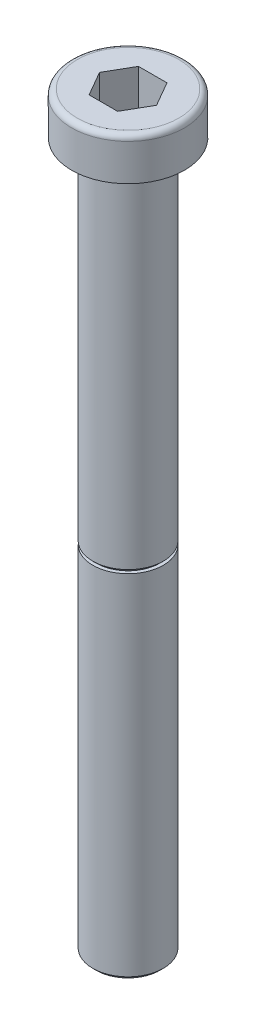
ISO-10303-21;
HEADER;
FILE_DESCRIPTION(('STEP AP214'),'2;1');
FILE_NAME('part.step','',(''),(''),'','','');
FILE_SCHEMA(('AUTOMOTIVE_DESIGN { 1 0 10303 214 1 1 1 1 }'));
ENDSEC;
DATA;
#1=APPLICATION_CONTEXT('core data for automotive mechanical design processes');
#2=APPLICATION_PROTOCOL_DEFINITION('international standard','automotive_design',2000,#1);
#3=PRODUCT_CONTEXT('',#1,'mechanical');
#4=PRODUCT('Part','Part','',(#3));
#5=PRODUCT_RELATED_PRODUCT_CATEGORY('part','',(#4));
#6=PRODUCT_DEFINITION_FORMATION('','',#4);
#7=PRODUCT_DEFINITION_CONTEXT('part definition',#1,'design');
#8=PRODUCT_DEFINITION('design','',#6,#7);
#9=PRODUCT_DEFINITION_SHAPE('','',#8);
#10=(LENGTH_UNIT() NAMED_UNIT(*) SI_UNIT(.MILLI.,.METRE.));
#11=(NAMED_UNIT(*) PLANE_ANGLE_UNIT() SI_UNIT($,.RADIAN.));
#12=(NAMED_UNIT(*) SI_UNIT($,.STERADIAN.) SOLID_ANGLE_UNIT());
#13=UNCERTAINTY_MEASURE_WITH_UNIT(LENGTH_MEASURE(1.E-05),#10,'distance_accuracy_value','');
#14=(GEOMETRIC_REPRESENTATION_CONTEXT(3) GLOBAL_UNCERTAINTY_ASSIGNED_CONTEXT((#13)) GLOBAL_UNIT_ASSIGNED_CONTEXT((#10,
#11,#12)) REPRESENTATION_CONTEXT('',''));
#15=CARTESIAN_POINT('',(0.,0.,0.));
#16=DIRECTION('',(0.,0.,1.));
#17=DIRECTION('',(1.,0.,0.));
#18=AXIS2_PLACEMENT_3D('',#15,#16,#17);
#19=CARTESIAN_POINT('',(-631.679347611486,-137.30907216884,-866.236135779287));
#20=DIRECTION('',(0.,1.,0.));
#21=DIRECTION('',(-1.,0.,0.));
#22=AXIS2_PLACEMENT_3D('',#19,#20,#21);
#23=PLANE('',#22);
#24=DIRECTION('',(-0.5,0.,-0.866025403784439));
#25=VECTOR('',#24,1.);
#26=CARTESIAN_POINT('',(-634.710436524731,-137.30907216884,-864.486135779287));
#27=LINE('',#26,#25);
#28=CARTESIAN_POINT('',(-633.70007355365,-137.30907216884,-862.736135779289));
#29=VERTEX_POINT('',#28);
#30=CARTESIAN_POINT('',(-635.720799495813,-137.30907216884,-866.236135779288));
#31=VERTEX_POINT('',#30);
#32=EDGE_CURVE('E355',#29,#31,#27,.T.);
#33=ORIENTED_EDGE('',*,*,#32,.F.);
#34=DIRECTION('',(-1.,0.,0.));
#35=VECTOR('',#34,1.);
#36=CARTESIAN_POINT('',(-631.679347611486,-137.30907216884,-862.736135779289));
#37=LINE('',#36,#35);
#38=CARTESIAN_POINT('',(-629.658621669321,-137.30907216884,-862.736135779289));
#39=VERTEX_POINT('',#38);
#40=EDGE_CURVE('E356',#39,#29,#37,.T.);
#41=ORIENTED_EDGE('',*,*,#40,.F.);
#42=DIRECTION('',(-0.5,0.,0.866025403784439));
#43=VECTOR('',#42,1.);
#44=CARTESIAN_POINT('',(-628.64825869824,-137.30907216884,-864.486135779287));
#45=LINE('',#44,#43);
#46=CARTESIAN_POINT('',(-627.637895727158,-137.30907216884,-866.236135779287));
#47=VERTEX_POINT('',#46);
#48=EDGE_CURVE('E67',#47,#39,#45,.T.);
#49=ORIENTED_EDGE('',*,*,#48,.F.);
#50=DIRECTION('',(0.5,0.,0.866025403784439));
#51=VECTOR('',#50,1.);
#52=CARTESIAN_POINT('',(-628.64825869824,-137.30907216884,-867.986135779288));
#53=LINE('',#52,#51);
#54=CARTESIAN_POINT('',(-629.658621669322,-137.30907216884,-869.736135779289));
#55=VERTEX_POINT('',#54);
#56=EDGE_CURVE('E64',#55,#47,#53,.T.);
#57=ORIENTED_EDGE('',*,*,#56,.F.);
#58=DIRECTION('',(1.,0.,0.));
#59=VECTOR('',#58,1.);
#60=CARTESIAN_POINT('',(-631.679347611486,-137.30907216884,-869.736135779289));
#61=LINE('',#60,#59);
#62=CARTESIAN_POINT('',(-633.700073553649,-137.30907216884,-869.736135779289));
#63=VERTEX_POINT('',#62);
#64=EDGE_CURVE('E61',#63,#55,#61,.T.);
#65=ORIENTED_EDGE('',*,*,#64,.F.);
#66=DIRECTION('',(0.5,0.,-0.866025403784438));
#67=VECTOR('',#66,1.);
#68=CARTESIAN_POINT('',(-634.710436524731,-137.30907216884,-867.986135779288));
#69=LINE('',#68,#67);
#70=EDGE_CURVE('E81',#31,#63,#69,.T.);
#71=ORIENTED_EDGE('',*,*,#70,.F.);
#72=EDGE_LOOP('',(#33,#41,#49,#57,#65,#71));
#73=FACE_BOUND('',#72,.T.);
#74=ADVANCED_FACE('F17',(#73),#23,.T.);
#75=CARTESIAN_POINT('',(-628.64825869824,-131.30907216884,-867.986135779288));
#76=DIRECTION('',(-0.866025403784439,0.,0.5));
#77=DIRECTION('',(0.5,0.,0.866025403784439));
#78=AXIS2_PLACEMENT_3D('',#75,#76,#77);
#79=PLANE('',#78);
#80=DIRECTION('',(-0.499999999999829,0.,-0.866025403784537));
#81=VECTOR('',#80,1.);
#82=CARTESIAN_POINT('',(-627.637895727158,-131.30907216884,-866.236135779287));
#83=LINE('',#82,#81);
#84=CARTESIAN_POINT('',(-627.637895727158,-131.30907216884,-866.236135779287));
#85=VERTEX_POINT('',#84);
#86=CARTESIAN_POINT('',(-629.658621669322,-131.30907216884,-869.736135779289));
#87=VERTEX_POINT('',#86);
#88=EDGE_CURVE('E77',#85,#87,#83,.T.);
#89=ORIENTED_EDGE('',*,*,#88,.T.);
#90=DIRECTION('',(0.,1.,0.));
#91=VECTOR('',#90,1.);
#92=CARTESIAN_POINT('',(-629.658621669322,-131.30907216884,-869.736135779289));
#93=LINE('',#92,#91);
#94=EDGE_CURVE('E74',#55,#87,#93,.T.);
#95=ORIENTED_EDGE('',*,*,#94,.F.);
#96=ORIENTED_EDGE('',*,*,#56,.T.);
#97=DIRECTION('',(0.,1.,0.));
#98=VECTOR('',#97,1.);
#99=CARTESIAN_POINT('',(-627.637895727158,-131.30907216884,-866.236135779287));
#100=LINE('',#99,#98);
#101=EDGE_CURVE('E131',#85,#47,#100,.F.);
#102=ORIENTED_EDGE('',*,*,#101,.F.);
#103=EDGE_LOOP('',(#89,#95,#96,#102));
#104=FACE_BOUND('',#103,.T.);
#105=ADVANCED_FACE('F75',(#104),#79,.T.);
#106=CARTESIAN_POINT('',(-631.679347611486,-131.30907216884,-869.736135779289));
#107=DIRECTION('',(0.,0.,1.));
#108=DIRECTION('',(1.,0.,0.));
#109=AXIS2_PLACEMENT_3D('',#106,#107,#108);
#110=PLANE('',#109);
#111=DIRECTION('',(1.,0.,0.));
#112=VECTOR('',#111,1.);
#113=CARTESIAN_POINT('',(-635.679347611485,-131.30907216884,-869.736135779289));
#114=LINE('',#113,#112);
#115=CARTESIAN_POINT('',(-633.700073553649,-131.30907216884,-869.736135779289));
#116=VERTEX_POINT('',#115);
#117=EDGE_CURVE('E128',#87,#116,#114,.F.);
#118=ORIENTED_EDGE('',*,*,#117,.T.);
#119=DIRECTION('',(0.,1.,0.));
#120=VECTOR('',#119,1.);
#121=CARTESIAN_POINT('',(-633.700073553649,-131.30907216884,-869.736135779289));
#122=LINE('',#121,#120);
#123=EDGE_CURVE('E85',#63,#116,#122,.T.);
#124=ORIENTED_EDGE('',*,*,#123,.F.);
#125=ORIENTED_EDGE('',*,*,#64,.T.);
#126=ORIENTED_EDGE('',*,*,#94,.T.);
#127=EDGE_LOOP('',(#118,#124,#125,#126));
#128=FACE_BOUND('',#127,.T.);
#129=ADVANCED_FACE('F83',(#128),#110,.T.);
#130=CARTESIAN_POINT('',(-634.710436524731,-131.30907216884,-867.986135779288));
#131=DIRECTION('',(0.866025403784438,0.,0.5));
#132=DIRECTION('',(0.5,0.,-0.866025403784438));
#133=AXIS2_PLACEMENT_3D('',#130,#131,#132);
#134=PLANE('',#133);
#135=DIRECTION('',(-0.500000000000261,0.,0.866025403784288));
#136=VECTOR('',#135,1.);
#137=CARTESIAN_POINT('',(-633.700073553649,-131.30907216884,-869.736135779288));
#138=LINE('',#137,#136);
#139=CARTESIAN_POINT('',(-635.720799495814,-131.30907216884,-866.236135779288));
#140=VERTEX_POINT('',#139);
#141=EDGE_CURVE('E125',#116,#140,#138,.T.);
#142=ORIENTED_EDGE('',*,*,#141,.T.);
#143=DIRECTION('',(0.,1.,0.));
#144=VECTOR('',#143,1.);
#145=CARTESIAN_POINT('',(-635.720799495814,-131.30907216884,-866.236135779289));
#146=LINE('',#145,#144);
#147=EDGE_CURVE('E347',#31,#140,#146,.T.);
#148=ORIENTED_EDGE('',*,*,#147,.F.);
#149=ORIENTED_EDGE('',*,*,#70,.T.);
#150=ORIENTED_EDGE('',*,*,#123,.T.);
#151=EDGE_LOOP('',(#142,#148,#149,#150));
#152=FACE_BOUND('',#151,.T.);
#153=ADVANCED_FACE('F188',(#152),#134,.T.);
#154=CARTESIAN_POINT('',(-634.710436524731,-131.30907216884,-864.486135779287));
#155=DIRECTION('',(0.866025403784439,0.,-0.5));
#156=DIRECTION('',(-0.5,0.,-0.866025403784439));
#157=AXIS2_PLACEMENT_3D('',#154,#155,#156);
#158=PLANE('',#157);
#159=DIRECTION('',(0.499999999999998,0.,0.86602540378444));
#160=VECTOR('',#159,1.);
#161=CARTESIAN_POINT('',(-635.720799495814,-131.30907216884,-866.236135779288));
#162=LINE('',#161,#160);
#163=CARTESIAN_POINT('',(-633.70007355365,-131.30907216884,-862.736135779289));
#164=VERTEX_POINT('',#163);
#165=EDGE_CURVE('E115',#140,#164,#162,.T.);
#166=ORIENTED_EDGE('',*,*,#165,.T.);
#167=DIRECTION('',(0.,1.,0.));
#168=VECTOR('',#167,1.);
#169=CARTESIAN_POINT('',(-633.70007355365,-131.30907216884,-862.736135779289));
#170=LINE('',#169,#168);
#171=EDGE_CURVE('E363',#29,#164,#170,.T.);
#172=ORIENTED_EDGE('',*,*,#171,.F.);
#173=ORIENTED_EDGE('',*,*,#32,.T.);
#174=ORIENTED_EDGE('',*,*,#147,.T.);
#175=EDGE_LOOP('',(#166,#172,#173,#174));
#176=FACE_BOUND('',#175,.T.);
#177=ADVANCED_FACE('F184',(#176),#158,.T.);
#178=CARTESIAN_POINT('',(-631.679347611486,-131.30907216884,-862.736135779289));
#179=DIRECTION('',(0.,0.,-1.));
#180=DIRECTION('',(-1.,0.,0.));
#181=AXIS2_PLACEMENT_3D('',#178,#179,#180);
#182=PLANE('',#181);
#183=DIRECTION('',(1.,0.,0.));
#184=VECTOR('',#183,1.);
#185=CARTESIAN_POINT('',(-635.679347611485,-131.30907216884,-862.736135779289));
#186=LINE('',#185,#184);
#187=CARTESIAN_POINT('',(-629.658621669321,-131.30907216884,-862.736135779289));
#188=VERTEX_POINT('',#187);
#189=EDGE_CURVE('E109',#164,#188,#186,.T.);
#190=ORIENTED_EDGE('',*,*,#189,.T.);
#191=DIRECTION('',(0.,1.,0.));
#192=VECTOR('',#191,1.);
#193=CARTESIAN_POINT('',(-629.658621669321,-131.30907216884,-862.736135779289));
#194=LINE('',#193,#192);
#195=EDGE_CURVE('E362',#39,#188,#194,.T.);
#196=ORIENTED_EDGE('',*,*,#195,.F.);
#197=ORIENTED_EDGE('',*,*,#40,.T.);
#198=ORIENTED_EDGE('',*,*,#171,.T.);
#199=EDGE_LOOP('',(#190,#196,#197,#198));
#200=FACE_BOUND('',#199,.T.);
#201=ADVANCED_FACE('F181',(#200),#182,.T.);
#202=CARTESIAN_POINT('',(-628.64825869824,-131.30907216884,-864.486135779287));
#203=DIRECTION('',(-0.866025403784439,0.,-0.5));
#204=DIRECTION('',(-0.5,0.,0.866025403784439));
#205=AXIS2_PLACEMENT_3D('',#202,#203,#204);
#206=PLANE('',#205);
#207=DIRECTION('',(0.500000000000084,0.,-0.86602540378439));
#208=VECTOR('',#207,1.);
#209=CARTESIAN_POINT('',(-629.658621669321,-131.30907216884,-862.736135779289));
#210=LINE('',#209,#208);
#211=EDGE_CURVE('E104',#188,#85,#210,.T.);
#212=ORIENTED_EDGE('',*,*,#211,.T.);
#213=ORIENTED_EDGE('',*,*,#101,.T.);
#214=ORIENTED_EDGE('',*,*,#48,.T.);
#215=ORIENTED_EDGE('',*,*,#195,.T.);
#216=EDGE_LOOP('',(#212,#213,#214,#215));
#217=FACE_BOUND('',#216,.T.);
#218=ADVANCED_FACE('F177',(#217),#206,.T.);
#219=CARTESIAN_POINT('',(-633.929347611487,-237.30907216884,-866.236135779287));
#220=DIRECTION('',(0.,1.,0.));
#221=DIRECTION('',(-1.,0.,0.));
#222=AXIS2_PLACEMENT_3D('',#219,#220,#221);
#223=PLANE('',#222);
#224=CARTESIAN_POINT('',(-631.679347611486,-237.30907216884,-866.236135779287));
#225=DIRECTION('',(0.,1.,0.));
#226=DIRECTION('',(0.,0.,1.));
#227=AXIS2_PLACEMENT_3D('',#224,#225,#226);
#228=CIRCLE('',#227,4.50000000000006);
#229=CARTESIAN_POINT('',(-631.679347611486,-237.30907216884,-861.736135779287));
#230=VERTEX_POINT('',#229);
#231=EDGE_CURVE('E102',#230,#230,#228,.T.);
#232=ORIENTED_EDGE('',*,*,#231,.F.);
#233=EDGE_LOOP('',(#232));
#234=FACE_BOUND('',#233,.T.);
#235=ADVANCED_FACE('F172',(#234),#223,.F.);
#236=CARTESIAN_POINT('',(-635.679347611485,-131.30907216884,-866.236135779287));
#237=DIRECTION('',(0.,-1.,0.));
#238=DIRECTION('',(1.,0.,0.));
#239=AXIS2_PLACEMENT_3D('',#236,#237,#238);
#240=PLANE('',#239);
#241=ORIENTED_EDGE('',*,*,#189,.F.);
#242=ORIENTED_EDGE('',*,*,#165,.F.);
#243=ORIENTED_EDGE('',*,*,#141,.F.);
#244=ORIENTED_EDGE('',*,*,#117,.F.);
#245=ORIENTED_EDGE('',*,*,#88,.F.);
#246=ORIENTED_EDGE('',*,*,#211,.F.);
#247=EDGE_LOOP('',(#241,#242,#243,#244,#245,#246));
#248=FACE_BOUND('',#247,.T.);
#249=CARTESIAN_POINT('',(-631.679347611486,-131.309072168841,-866.236135779287));
#250=DIRECTION('',(0.,-1.,0.));
#251=DIRECTION('',(0.,0.,1.));
#252=AXIS2_PLACEMENT_3D('',#249,#250,#251);
#253=CIRCLE('',#252,7.20000000000021);
#254=CARTESIAN_POINT('',(-631.679347611486,-131.309072168841,-859.036135779287));
#255=VERTEX_POINT('',#254);
#256=CARTESIAN_POINT('',(-631.679347611486,-131.309072168841,-873.436135779288));
#257=VERTEX_POINT('',#256);
#258=EDGE_CURVE('E107',#255,#257,#253,.T.);
#259=ORIENTED_EDGE('',*,*,#258,.F.);
#260=CARTESIAN_POINT('',(-631.679347611486,-131.309072168841,-866.236135779287));
#261=DIRECTION('',(0.,-1.,0.));
#262=DIRECTION('',(0.,0.,-1.));
#263=AXIS2_PLACEMENT_3D('',#260,#261,#262);
#264=CIRCLE('',#263,7.20000000000087);
#265=EDGE_CURVE('E36',#257,#255,#264,.T.);
#266=ORIENTED_EDGE('',*,*,#265,.F.);
#267=EDGE_LOOP('',(#259,#266));
#268=FACE_BOUND('',#267,.T.);
#269=ADVANCED_FACE('F163',(#248,#268),#240,.F.);
#270=CARTESIAN_POINT('',(-631.679347611486,-236.80907216884,-866.236135779287));
#271=DIRECTION('',(0.,1.,0.));
#272=DIRECTION('',(0.,0.,1.));
#273=AXIS2_PLACEMENT_3D('',#270,#271,#272);
#274=CONICAL_SURFACE('',#273,5.,0.785398163397476);
#275=ORIENTED_EDGE('',*,*,#231,.T.);
#276=EDGE_LOOP('',(#275));
#277=FACE_BOUND('',#276,.T.);
#278=CARTESIAN_POINT('',(-631.679347611486,-236.80907216884,-866.236135779287));
#279=DIRECTION('',(0.,-1.,0.));
#280=DIRECTION('',(1.,0.,0.));
#281=AXIS2_PLACEMENT_3D('',#278,#279,#280);
#282=CIRCLE('',#281,4.99999999999999);
#283=CARTESIAN_POINT('',(-626.679347611486,-236.80907216884,-866.236135779287));
#284=VERTEX_POINT('',#283);
#285=EDGE_CURVE('E156',#284,#284,#282,.F.);
#286=ORIENTED_EDGE('',*,*,#285,.F.);
#287=EDGE_LOOP('',(#286));
#288=FACE_BOUND('',#287,.T.);
#289=ADVANCED_FACE('F149',(#277,#288),#274,.T.);
#290=CARTESIAN_POINT('',(-631.679347611486,-132.109072168841,-866.236135779287));
#291=DIRECTION('',(0.,1.,0.));
#292=DIRECTION('',(0.,0.,-1.));
#293=AXIS2_PLACEMENT_3D('',#290,#291,#292);
#294=TOROIDAL_SURFACE('',#293,7.2000000000001,0.8);
#295=CARTESIAN_POINT('',(-631.679347611486,-132.109072168841,-866.236135779287));
#296=DIRECTION('',(0.,-1.,0.));
#297=DIRECTION('',(1.,0.,0.));
#298=AXIS2_PLACEMENT_3D('',#295,#296,#297);
#299=CIRCLE('',#298,8.);
#300=CARTESIAN_POINT('',(-623.679347611486,-132.109072168841,-866.236135779287));
#301=VERTEX_POINT('',#300);
#302=EDGE_CURVE('E101',#301,#301,#299,.T.);
#303=ORIENTED_EDGE('',*,*,#302,.F.);
#304=EDGE_LOOP('',(#303));
#305=FACE_BOUND('',#304,.T.);
#306=ORIENTED_EDGE('',*,*,#258,.T.);
#307=ORIENTED_EDGE('',*,*,#265,.T.);
#308=EDGE_LOOP('',(#306,#307));
#309=FACE_BOUND('',#308,.T.);
#310=ADVANCED_FACE('F137',(#305,#309),#294,.T.);
#311=CARTESIAN_POINT('',(-631.679347611486,-212.059072168841,-866.236135779287));
#312=DIRECTION('',(0.,-1.,0.));
#313=DIRECTION('',(1.,0.,0.));
#314=AXIS2_PLACEMENT_3D('',#311,#312,#313);
#315=CYLINDRICAL_SURFACE('',#314,4.99999999999999);
#316=CARTESIAN_POINT('',(-631.679347611486,-187.30907216884,-866.236135779287));
#317=DIRECTION('',(0.,-1.,0.));
#318=DIRECTION('',(1.,0.,0.));
#319=AXIS2_PLACEMENT_3D('',#316,#317,#318);
#320=CIRCLE('',#319,4.99999999999999);
#321=CARTESIAN_POINT('',(-626.679347611486,-187.30907216884,-866.236135779287));
#322=VERTEX_POINT('',#321);
#323=EDGE_CURVE('E98',#322,#322,#320,.T.);
#324=ORIENTED_EDGE('',*,*,#323,.T.);
#325=EDGE_LOOP('',(#324));
#326=FACE_BOUND('',#325,.T.);
#327=ORIENTED_EDGE('',*,*,#285,.T.);
#328=EDGE_LOOP('',(#327));
#329=FACE_BOUND('',#328,.T.);
#330=ADVANCED_FACE('F148',(#326,#329),#315,.T.);
#331=CARTESIAN_POINT('',(-631.679347611486,-134.30907216884,-866.236135779287));
#332=DIRECTION('',(0.,-1.,0.));
#333=DIRECTION('',(1.,0.,0.));
#334=AXIS2_PLACEMENT_3D('',#331,#332,#333);
#335=CYLINDRICAL_SURFACE('',#334,8.);
#336=ORIENTED_EDGE('',*,*,#302,.T.);
#337=EDGE_LOOP('',(#336));
#338=FACE_BOUND('',#337,.T.);
#339=CARTESIAN_POINT('',(-631.679347611486,-137.30907216884,-866.236135779287));
#340=DIRECTION('',(0.,-1.,0.));
#341=DIRECTION('',(1.,0.,0.));
#342=AXIS2_PLACEMENT_3D('',#339,#340,#341);
#343=CIRCLE('',#342,8.);
#344=CARTESIAN_POINT('',(-623.679347611486,-137.30907216884,-866.236135779287));
#345=VERTEX_POINT('',#344);
#346=EDGE_CURVE('E95',#345,#345,#343,.F.);
#347=ORIENTED_EDGE('',*,*,#346,.T.);
#348=EDGE_LOOP('',(#347));
#349=FACE_BOUND('',#348,.T.);
#350=ADVANCED_FACE('F217',(#338,#349),#335,.T.);
#351=CARTESIAN_POINT('',(-636.429347611487,-187.30907216884,-866.236135779287));
#352=DIRECTION('',(0.,-1.,0.));
#353=DIRECTION('',(1.,0.,0.));
#354=AXIS2_PLACEMENT_3D('',#351,#352,#353);
#355=PLANE('',#354);
#356=CARTESIAN_POINT('',(-631.679347611486,-187.30907216884,-866.236135779287));
#357=DIRECTION('',(0.,1.,0.));
#358=DIRECTION('',(0.,0.,1.));
#359=AXIS2_PLACEMENT_3D('',#356,#357,#358);
#360=CIRCLE('',#359,4.5);
#361=CARTESIAN_POINT('',(-631.679347611486,-187.30907216884,-861.736135779287));
#362=VERTEX_POINT('',#361);
#363=EDGE_CURVE('E92',#362,#362,#360,.T.);
#364=ORIENTED_EDGE('',*,*,#363,.F.);
#365=EDGE_LOOP('',(#364));
#366=FACE_BOUND('',#365,.T.);
#367=ORIENTED_EDGE('',*,*,#323,.F.);
#368=EDGE_LOOP('',(#367));
#369=FACE_BOUND('',#368,.T.);
#370=ADVANCED_FACE('F214',(#366,#369),#355,.F.);
#371=CARTESIAN_POINT('',(-638.179347611485,-137.30907216884,-866.236135779287));
#372=DIRECTION('',(0.,1.,0.));
#373=DIRECTION('',(-1.,0.,0.));
#374=AXIS2_PLACEMENT_3D('',#371,#372,#373);
#375=PLANE('',#374);
#376=CARTESIAN_POINT('',(-631.679347611486,-137.30907216884,-866.236135779287));
#377=DIRECTION('',(0.,-1.,0.));
#378=DIRECTION('',(1.,0.,0.));
#379=AXIS2_PLACEMENT_3D('',#376,#377,#378);
#380=CIRCLE('',#379,4.99999999999999);
#381=CARTESIAN_POINT('',(-626.679347611486,-137.30907216884,-866.236135779287));
#382=VERTEX_POINT('',#381);
#383=EDGE_CURVE('E28',#382,#382,#380,.T.);
#384=ORIENTED_EDGE('',*,*,#383,.F.);
#385=EDGE_LOOP('',(#384));
#386=FACE_BOUND('',#385,.T.);
#387=ORIENTED_EDGE('',*,*,#346,.F.);
#388=EDGE_LOOP('',(#387));
#389=FACE_BOUND('',#388,.T.);
#390=ADVANCED_FACE('F207',(#386,#389),#375,.F.);
#391=CARTESIAN_POINT('',(-631.679347611486,-186.80907216884,-866.236135779287));
#392=DIRECTION('',(0.,1.,0.));
#393=DIRECTION('',(0.,0.,1.));
#394=AXIS2_PLACEMENT_3D('',#391,#392,#393);
#395=CONICAL_SURFACE('',#394,5.,0.785398163397448);
#396=CARTESIAN_POINT('',(-631.679347611486,-186.80907216884,-866.236135779287));
#397=DIRECTION('',(0.,-1.,0.));
#398=DIRECTION('',(1.,0.,0.));
#399=AXIS2_PLACEMENT_3D('',#396,#397,#398);
#400=CIRCLE('',#399,4.99999999999999);
#401=CARTESIAN_POINT('',(-626.679347611486,-186.80907216884,-866.236135779287));
#402=VERTEX_POINT('',#401);
#403=EDGE_CURVE('E11',#402,#402,#400,.F.);
#404=ORIENTED_EDGE('',*,*,#403,.F.);
#405=EDGE_LOOP('',(#404));
#406=FACE_BOUND('',#405,.T.);
#407=ORIENTED_EDGE('',*,*,#363,.T.);
#408=EDGE_LOOP('',(#407));
#409=FACE_BOUND('',#408,.T.);
#410=ADVANCED_FACE('F201',(#406,#409),#395,.T.);
#411=CARTESIAN_POINT('',(-631.679347611486,-162.05907216884,-866.236135779287));
#412=DIRECTION('',(0.,-1.,0.));
#413=DIRECTION('',(1.,0.,0.));
#414=AXIS2_PLACEMENT_3D('',#411,#412,#413);
#415=CYLINDRICAL_SURFACE('',#414,4.99999999999999);
#416=ORIENTED_EDGE('',*,*,#403,.T.);
#417=EDGE_LOOP('',(#416));
#418=FACE_BOUND('',#417,.T.);
#419=ORIENTED_EDGE('',*,*,#383,.T.);
#420=EDGE_LOOP('',(#419));
#421=FACE_BOUND('',#420,.T.);
#422=ADVANCED_FACE('F199',(#418,#421),#415,.T.);
#423=CLOSED_SHELL('',(#74,#105,#129,#153,#177,#201,#218,#235,#269,#289,#310,#330,#350,#370,#390,
#410,#422));
#424=MANIFOLD_SOLID_BREP('B1',#423);
#425=ADVANCED_BREP_SHAPE_REPRESENTATION('',(#18,#424),#14);
#426=SHAPE_DEFINITION_REPRESENTATION(#9,#425);
ENDSEC;
END-ISO-10303-21;
